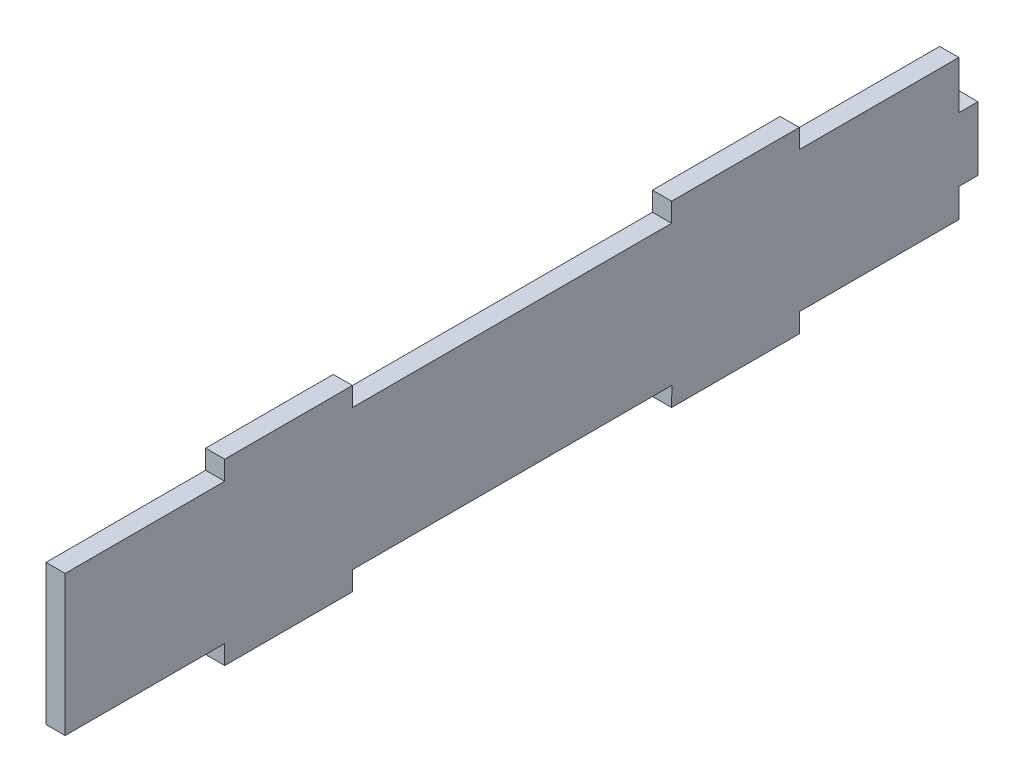
ISO-10303-21;
HEADER;
FILE_DESCRIPTION(('STEP AP214'),'2;1');
FILE_NAME('part.step','',(''),(''),'','','');
FILE_SCHEMA(('AUTOMOTIVE_DESIGN { 1 0 10303 214 1 1 1 1 }'));
ENDSEC;
DATA;
#1=APPLICATION_CONTEXT('core data for automotive mechanical design processes');
#2=APPLICATION_PROTOCOL_DEFINITION('international standard','automotive_design',2000,#1);
#3=PRODUCT_CONTEXT('',#1,'mechanical');
#4=PRODUCT('Part','Part','',(#3));
#5=PRODUCT_RELATED_PRODUCT_CATEGORY('part','',(#4));
#6=PRODUCT_DEFINITION_FORMATION('','',#4);
#7=PRODUCT_DEFINITION_CONTEXT('part definition',#1,'design');
#8=PRODUCT_DEFINITION('design','',#6,#7);
#9=PRODUCT_DEFINITION_SHAPE('','',#8);
#10=(LENGTH_UNIT() NAMED_UNIT(*) SI_UNIT(.MILLI.,.METRE.));
#11=(NAMED_UNIT(*) PLANE_ANGLE_UNIT() SI_UNIT($,.RADIAN.));
#12=(NAMED_UNIT(*) SI_UNIT($,.STERADIAN.) SOLID_ANGLE_UNIT());
#13=UNCERTAINTY_MEASURE_WITH_UNIT(LENGTH_MEASURE(1.E-05),#10,'distance_accuracy_value','');
#14=(GEOMETRIC_REPRESENTATION_CONTEXT(3) GLOBAL_UNCERTAINTY_ASSIGNED_CONTEXT((#13)) GLOBAL_UNIT_ASSIGNED_CONTEXT((#10,
#11,#12)) REPRESENTATION_CONTEXT('',''));
#15=CARTESIAN_POINT('',(0.,0.,0.));
#16=DIRECTION('',(0.,0.,1.));
#17=DIRECTION('',(1.,0.,0.));
#18=AXIS2_PLACEMENT_3D('',#15,#16,#17);
#19=CARTESIAN_POINT('',(-121.,7.50036982336795,-143.604067942456));
#20=DIRECTION('',(0.,1.,0.));
#21=DIRECTION('',(-1.,0.,0.));
#22=AXIS2_PLACEMENT_3D('',#19,#20,#21);
#23=PLANE('',#22);
#24=DIRECTION('',(0.,0.,1.));
#25=VECTOR('',#24,1.);
#26=CARTESIAN_POINT('',(-118.,7.50036982336795,-143.604067942456));
#27=LINE('',#26,#25);
#28=CARTESIAN_POINT('',(-118.,7.50036982336795,-143.604067942456));
#29=VERTEX_POINT('',#28);
#30=CARTESIAN_POINT('',(-118.,7.50036982336795,-140.604067942456));
#31=VERTEX_POINT('',#30);
#32=EDGE_CURVE('E224',#29,#31,#27,.T.);
#33=ORIENTED_EDGE('',*,*,#32,.T.);
#34=DIRECTION('',(1.,0.,0.));
#35=VECTOR('',#34,1.);
#36=CARTESIAN_POINT('',(-121.,7.50036982336795,-140.604067942456));
#37=LINE('',#36,#35);
#38=CARTESIAN_POINT('',(-121.,7.50036982336795,-140.604067942456));
#39=VERTEX_POINT('',#38);
#40=EDGE_CURVE('E11',#39,#31,#37,.T.);
#41=ORIENTED_EDGE('',*,*,#40,.F.);
#42=DIRECTION('',(0.,0.,1.));
#43=VECTOR('',#42,1.);
#44=CARTESIAN_POINT('',(-121.,7.50036982336795,-143.604067942456));
#45=LINE('',#44,#43);
#46=CARTESIAN_POINT('',(-121.,7.50036982336795,-143.604067942456));
#47=VERTEX_POINT('',#46);
#48=EDGE_CURVE('E270',#47,#39,#45,.T.);
#49=ORIENTED_EDGE('',*,*,#48,.F.);
#50=DIRECTION('',(1.,0.,0.));
#51=VECTOR('',#50,1.);
#52=CARTESIAN_POINT('',(-121.,7.50036982336795,-143.604067942456));
#53=LINE('',#52,#51);
#54=EDGE_CURVE('E220',#47,#29,#53,.T.);
#55=ORIENTED_EDGE('',*,*,#54,.T.);
#56=EDGE_LOOP('',(#33,#41,#49,#55));
#57=FACE_BOUND('',#56,.T.);
#58=ADVANCED_FACE('F32',(#57),#23,.F.);
#59=CARTESIAN_POINT('',(-121.,7.50036982336795,-140.604067942456));
#60=DIRECTION('',(0.,0.,1.));
#61=DIRECTION('',(1.,0.,0.));
#62=AXIS2_PLACEMENT_3D('',#59,#60,#61);
#63=PLANE('',#62);
#64=DIRECTION('',(0.,-1.,0.));
#65=VECTOR('',#64,1.);
#66=CARTESIAN_POINT('',(-118.,7.50036982336795,-140.604067942456));
#67=LINE('',#66,#65);
#68=CARTESIAN_POINT('',(-118.,3.00036982336795,-140.604067942456));
#69=VERTEX_POINT('',#68);
#70=EDGE_CURVE('E227',#31,#69,#67,.T.);
#71=ORIENTED_EDGE('',*,*,#70,.T.);
#72=DIRECTION('',(1.,0.,0.));
#73=VECTOR('',#72,1.);
#74=CARTESIAN_POINT('',(-121.,3.00036982336795,-140.604067942456));
#75=LINE('',#74,#73);
#76=CARTESIAN_POINT('',(-121.,3.00036982336795,-140.604067942456));
#77=VERTEX_POINT('',#76);
#78=EDGE_CURVE('E40',#77,#69,#75,.T.);
#79=ORIENTED_EDGE('',*,*,#78,.F.);
#80=DIRECTION('',(0.,-1.,0.));
#81=VECTOR('',#80,1.);
#82=CARTESIAN_POINT('',(-121.,7.50036982336795,-140.604067942456));
#83=LINE('',#82,#81);
#84=EDGE_CURVE('E139',#39,#77,#83,.T.);
#85=ORIENTED_EDGE('',*,*,#84,.F.);
#86=ORIENTED_EDGE('',*,*,#40,.T.);
#87=EDGE_LOOP('',(#71,#79,#85,#86));
#88=FACE_BOUND('',#87,.T.);
#89=ADVANCED_FACE('F408',(#88),#63,.F.);
#90=CARTESIAN_POINT('',(-121.,3.00036982336795,-115.604067942456));
#91=DIRECTION('',(0.,1.,0.));
#92=DIRECTION('',(-1.,0.,0.));
#93=AXIS2_PLACEMENT_3D('',#90,#91,#92);
#94=PLANE('',#93);
#95=DIRECTION('',(0.,0.,1.));
#96=VECTOR('',#95,1.);
#97=CARTESIAN_POINT('',(-118.,3.00036982336795,-115.604067942456));
#98=LINE('',#97,#96);
#99=CARTESIAN_POINT('',(-118.,3.00036982336795,-115.604067942456));
#100=VERTEX_POINT('',#99);
#101=EDGE_CURVE('E229',#69,#100,#98,.T.);
#102=ORIENTED_EDGE('',*,*,#101,.T.);
#103=DIRECTION('',(1.,0.,0.));
#104=VECTOR('',#103,1.);
#105=CARTESIAN_POINT('',(-121.,3.00036982336795,-115.604067942456));
#106=LINE('',#105,#104);
#107=CARTESIAN_POINT('',(-121.,3.00036982336795,-115.604067942456));
#108=VERTEX_POINT('',#107);
#109=EDGE_CURVE('E325',#108,#100,#106,.T.);
#110=ORIENTED_EDGE('',*,*,#109,.F.);
#111=DIRECTION('',(0.,0.,1.));
#112=VECTOR('',#111,1.);
#113=CARTESIAN_POINT('',(-121.,3.00036982336795,-115.604067942456));
#114=LINE('',#113,#112);
#115=EDGE_CURVE('E333',#77,#108,#114,.T.);
#116=ORIENTED_EDGE('',*,*,#115,.F.);
#117=ORIENTED_EDGE('',*,*,#78,.T.);
#118=EDGE_LOOP('',(#102,#110,#116,#117));
#119=FACE_BOUND('',#118,.T.);
#120=ADVANCED_FACE('F331',(#119),#94,.F.);
#121=CARTESIAN_POINT('',(-121.,0.00036982336792806,-115.604067942456));
#122=DIRECTION('',(0.,0.,1.));
#123=DIRECTION('',(1.,0.,0.));
#124=AXIS2_PLACEMENT_3D('',#121,#122,#123);
#125=PLANE('',#124);
#126=DIRECTION('',(0.,-1.,0.));
#127=VECTOR('',#126,1.);
#128=CARTESIAN_POINT('',(-118.,0.000369823367928476,-115.604067942456));
#129=LINE('',#128,#127);
#130=CARTESIAN_POINT('',(-118.,0.000369823367928476,-115.604067942456));
#131=VERTEX_POINT('',#130);
#132=EDGE_CURVE('E231',#100,#131,#129,.T.);
#133=ORIENTED_EDGE('',*,*,#132,.T.);
#134=DIRECTION('',(1.,0.,0.));
#135=VECTOR('',#134,1.);
#136=CARTESIAN_POINT('',(-121.,0.00036982336792806,-115.604067942456));
#137=LINE('',#136,#135);
#138=CARTESIAN_POINT('',(-121.,0.00036982336792806,-115.604067942456));
#139=VERTEX_POINT('',#138);
#140=EDGE_CURVE('E322',#139,#131,#137,.T.);
#141=ORIENTED_EDGE('',*,*,#140,.F.);
#142=DIRECTION('',(0.,-1.,0.));
#143=VECTOR('',#142,1.);
#144=CARTESIAN_POINT('',(-121.,0.00036982336792806,-115.604067942456));
#145=LINE('',#144,#143);
#146=EDGE_CURVE('E351',#108,#139,#145,.T.);
#147=ORIENTED_EDGE('',*,*,#146,.F.);
#148=ORIENTED_EDGE('',*,*,#109,.T.);
#149=EDGE_LOOP('',(#133,#141,#147,#148));
#150=FACE_BOUND('',#149,.T.);
#151=ADVANCED_FACE('F342',(#150),#125,.F.);
#152=CARTESIAN_POINT('',(-121.,0.00036982336792806,-95.6040679424561));
#153=DIRECTION('',(0.,1.,0.));
#154=DIRECTION('',(-1.,0.,0.));
#155=AXIS2_PLACEMENT_3D('',#152,#153,#154);
#156=PLANE('',#155);
#157=DIRECTION('',(0.,0.,1.));
#158=VECTOR('',#157,1.);
#159=CARTESIAN_POINT('',(-118.,0.000369823367928476,-95.6040679424561));
#160=LINE('',#159,#158);
#161=CARTESIAN_POINT('',(-118.,0.000369823367928476,-95.6040679424561));
#162=VERTEX_POINT('',#161);
#163=EDGE_CURVE('E233',#131,#162,#160,.T.);
#164=ORIENTED_EDGE('',*,*,#163,.T.);
#165=DIRECTION('',(1.,0.,0.));
#166=VECTOR('',#165,1.);
#167=CARTESIAN_POINT('',(-121.,0.00036982336792806,-95.6040679424561));
#168=LINE('',#167,#166);
#169=CARTESIAN_POINT('',(-121.,0.00036982336792806,-95.6040679424561));
#170=VERTEX_POINT('',#169);
#171=EDGE_CURVE('E319',#170,#162,#168,.T.);
#172=ORIENTED_EDGE('',*,*,#171,.F.);
#173=DIRECTION('',(0.,0.,1.));
#174=VECTOR('',#173,1.);
#175=CARTESIAN_POINT('',(-121.,0.00036982336792806,-95.6040679424561));
#176=LINE('',#175,#174);
#177=EDGE_CURVE('E348',#139,#170,#176,.T.);
#178=ORIENTED_EDGE('',*,*,#177,.F.);
#179=ORIENTED_EDGE('',*,*,#140,.T.);
#180=EDGE_LOOP('',(#164,#172,#178,#179));
#181=FACE_BOUND('',#180,.T.);
#182=ADVANCED_FACE('F346',(#181),#156,.F.);
#183=CARTESIAN_POINT('',(-121.,2.99999999999999,-95.6511721188984));
#184=DIRECTION('',(0.,-0.0157013921474556,-0.99987672554402));
#185=DIRECTION('',(0.,0.99987672554402,-0.0157013921474556));
#186=AXIS2_PLACEMENT_3D('',#183,#184,#185);
#187=PLANE('',#186);
#188=DIRECTION('',(0.,0.99987672554402,-0.0157013921474556));
#189=VECTOR('',#188,1.);
#190=CARTESIAN_POINT('',(-118.,2.99999999999999,-95.6511721188984));
#191=LINE('',#190,#189);
#192=CARTESIAN_POINT('',(-118.,2.99999999999999,-95.6511721188984));
#193=VERTEX_POINT('',#192);
#194=EDGE_CURVE('E235',#162,#193,#191,.T.);
#195=ORIENTED_EDGE('',*,*,#194,.T.);
#196=DIRECTION('',(1.,0.,0.));
#197=VECTOR('',#196,1.);
#198=CARTESIAN_POINT('',(-121.,2.99999999999999,-95.6511721188984));
#199=LINE('',#198,#197);
#200=CARTESIAN_POINT('',(-121.,2.99999999999999,-95.6511721188984));
#201=VERTEX_POINT('',#200);
#202=EDGE_CURVE('E316',#201,#193,#199,.T.);
#203=ORIENTED_EDGE('',*,*,#202,.F.);
#204=DIRECTION('',(0.,0.99987672554402,-0.0157013921474556));
#205=VECTOR('',#204,1.);
#206=CARTESIAN_POINT('',(-121.,2.99999999999999,-95.6511721188984));
#207=LINE('',#206,#205);
#208=EDGE_CURVE('E350',#170,#201,#207,.T.);
#209=ORIENTED_EDGE('',*,*,#208,.F.);
#210=ORIENTED_EDGE('',*,*,#171,.T.);
#211=EDGE_LOOP('',(#195,#203,#209,#210));
#212=FACE_BOUND('',#211,.T.);
#213=ADVANCED_FACE('F421',(#212),#187,.F.);
#214=CARTESIAN_POINT('',(-121.,3.00036982336794,-45.6040679424561));
#215=DIRECTION('',(0.,0.999999999972698,-7.38950582699085E-06));
#216=DIRECTION('',(0.,7.38950582699085E-06,0.999999999972698));
#217=AXIS2_PLACEMENT_3D('',#214,#215,#216);
#218=PLANE('',#217);
#219=DIRECTION('',(0.,7.38950582699085E-06,0.999999999972698));
#220=VECTOR('',#219,1.);
#221=CARTESIAN_POINT('',(-118.,3.00036982336794,-45.6040679424561));
#222=LINE('',#221,#220);
#223=CARTESIAN_POINT('',(-118.,3.00036982336794,-45.6040679424561));
#224=VERTEX_POINT('',#223);
#225=EDGE_CURVE('E237',#193,#224,#222,.T.);
#226=ORIENTED_EDGE('',*,*,#225,.T.);
#227=DIRECTION('',(1.,0.,0.));
#228=VECTOR('',#227,1.);
#229=CARTESIAN_POINT('',(-121.,3.00036982336794,-45.6040679424561));
#230=LINE('',#229,#228);
#231=CARTESIAN_POINT('',(-121.,3.00036982336794,-45.6040679424561));
#232=VERTEX_POINT('',#231);
#233=EDGE_CURVE('E313',#232,#224,#230,.T.);
#234=ORIENTED_EDGE('',*,*,#233,.F.);
#235=DIRECTION('',(0.,7.38950582699085E-06,0.999999999972698));
#236=VECTOR('',#235,1.);
#237=CARTESIAN_POINT('',(-121.,3.00036982336794,-45.6040679424561));
#238=LINE('',#237,#236);
#239=EDGE_CURVE('E353',#201,#232,#238,.T.);
#240=ORIENTED_EDGE('',*,*,#239,.F.);
#241=ORIENTED_EDGE('',*,*,#202,.T.);
#242=EDGE_LOOP('',(#226,#234,#240,#241));
#243=FACE_BOUND('',#242,.T.);
#244=ADVANCED_FACE('F424',(#243),#218,.F.);
#245=CARTESIAN_POINT('',(-121.,0.00036982336792806,-45.6040679424561));
#246=DIRECTION('',(0.,0.,1.));
#247=DIRECTION('',(0.,-1.,0.));
#248=AXIS2_PLACEMENT_3D('',#245,#246,#247);
#249=PLANE('',#248);
#250=DIRECTION('',(0.,-1.,0.));
#251=VECTOR('',#250,1.);
#252=CARTESIAN_POINT('',(-118.,0.000369823367928476,-45.6040679424561));
#253=LINE('',#252,#251);
#254=CARTESIAN_POINT('',(-118.,0.000369823367928476,-45.6040679424561));
#255=VERTEX_POINT('',#254);
#256=EDGE_CURVE('E239',#224,#255,#253,.T.);
#257=ORIENTED_EDGE('',*,*,#256,.T.);
#258=DIRECTION('',(1.,0.,0.));
#259=VECTOR('',#258,1.);
#260=CARTESIAN_POINT('',(-121.,0.00036982336792806,-45.6040679424561));
#261=LINE('',#260,#259);
#262=CARTESIAN_POINT('',(-121.,0.00036982336792806,-45.6040679424561));
#263=VERTEX_POINT('',#262);
#264=EDGE_CURVE('E310',#263,#255,#261,.T.);
#265=ORIENTED_EDGE('',*,*,#264,.F.);
#266=DIRECTION('',(0.,-1.,0.));
#267=VECTOR('',#266,1.);
#268=CARTESIAN_POINT('',(-121.,0.00036982336792806,-45.6040679424561));
#269=LINE('',#268,#267);
#270=EDGE_CURVE('E359',#232,#263,#269,.T.);
#271=ORIENTED_EDGE('',*,*,#270,.F.);
#272=ORIENTED_EDGE('',*,*,#233,.T.);
#273=EDGE_LOOP('',(#257,#265,#271,#272));
#274=FACE_BOUND('',#273,.T.);
#275=ADVANCED_FACE('F428',(#274),#249,.F.);
#276=CARTESIAN_POINT('',(-121.,0.000369823367939081,-25.6040679424561));
#277=DIRECTION('',(0.,1.,0.));
#278=DIRECTION('',(0.,0.,1.));
#279=AXIS2_PLACEMENT_3D('',#276,#277,#278);
#280=PLANE('',#279);
#281=DIRECTION('',(0.,0.,1.));
#282=VECTOR('',#281,1.);
#283=CARTESIAN_POINT('',(-118.,0.000369823367939498,-25.6040679424561));
#284=LINE('',#283,#282);
#285=CARTESIAN_POINT('',(-118.,0.000369823367939498,-25.6040679424561));
#286=VERTEX_POINT('',#285);
#287=EDGE_CURVE('E241',#255,#286,#284,.T.);
#288=ORIENTED_EDGE('',*,*,#287,.T.);
#289=DIRECTION('',(1.,0.,0.));
#290=VECTOR('',#289,1.);
#291=CARTESIAN_POINT('',(-121.,0.000369823367939081,-25.6040679424561));
#292=LINE('',#291,#290);
#293=CARTESIAN_POINT('',(-121.,0.000369823367939081,-25.6040679424561));
#294=VERTEX_POINT('',#293);
#295=EDGE_CURVE('E307',#294,#286,#292,.T.);
#296=ORIENTED_EDGE('',*,*,#295,.F.);
#297=DIRECTION('',(0.,0.,1.));
#298=VECTOR('',#297,1.);
#299=CARTESIAN_POINT('',(-121.,0.000369823367939081,-25.6040679424561));
#300=LINE('',#299,#298);
#301=EDGE_CURVE('E361',#263,#294,#300,.T.);
#302=ORIENTED_EDGE('',*,*,#301,.F.);
#303=ORIENTED_EDGE('',*,*,#264,.T.);
#304=EDGE_LOOP('',(#288,#296,#302,#303));
#305=FACE_BOUND('',#304,.T.);
#306=ADVANCED_FACE('F432',(#305),#280,.F.);
#307=CARTESIAN_POINT('',(-121.,3.00036982336794,-25.6040679424561));
#308=DIRECTION('',(0.,0.,-1.));
#309=DIRECTION('',(-1.,0.,0.));
#310=AXIS2_PLACEMENT_3D('',#307,#308,#309);
#311=PLANE('',#310);
#312=DIRECTION('',(0.,1.,0.));
#313=VECTOR('',#312,1.);
#314=CARTESIAN_POINT('',(-118.,3.00036982336794,-25.6040679424561));
#315=LINE('',#314,#313);
#316=CARTESIAN_POINT('',(-118.,3.00036982336794,-25.6040679424561));
#317=VERTEX_POINT('',#316);
#318=EDGE_CURVE('E243',#286,#317,#315,.T.);
#319=ORIENTED_EDGE('',*,*,#318,.T.);
#320=DIRECTION('',(1.,0.,0.));
#321=VECTOR('',#320,1.);
#322=CARTESIAN_POINT('',(-121.,3.00036982336794,-25.6040679424561));
#323=LINE('',#322,#321);
#324=CARTESIAN_POINT('',(-121.,3.00036982336794,-25.6040679424561));
#325=VERTEX_POINT('',#324);
#326=EDGE_CURVE('E304',#325,#317,#323,.T.);
#327=ORIENTED_EDGE('',*,*,#326,.F.);
#328=DIRECTION('',(0.,1.,0.));
#329=VECTOR('',#328,1.);
#330=CARTESIAN_POINT('',(-121.,3.00036982336794,-25.6040679424561));
#331=LINE('',#330,#329);
#332=EDGE_CURVE('E363',#294,#325,#331,.T.);
#333=ORIENTED_EDGE('',*,*,#332,.F.);
#334=ORIENTED_EDGE('',*,*,#295,.T.);
#335=EDGE_LOOP('',(#319,#327,#333,#334));
#336=FACE_BOUND('',#335,.T.);
#337=ADVANCED_FACE('F436',(#336),#311,.F.);
#338=CARTESIAN_POINT('',(-121.,3.00036982336794,-0.604067942456082));
#339=DIRECTION('',(0.,1.,0.));
#340=DIRECTION('',(-1.,0.,0.));
#341=AXIS2_PLACEMENT_3D('',#338,#339,#340);
#342=PLANE('',#341);
#343=DIRECTION('',(0.,0.,1.));
#344=VECTOR('',#343,1.);
#345=CARTESIAN_POINT('',(-118.,3.00036982336794,-0.604067942456082));
#346=LINE('',#345,#344);
#347=CARTESIAN_POINT('',(-118.,3.00036982336794,-0.604067942456082));
#348=VERTEX_POINT('',#347);
#349=EDGE_CURVE('E245',#317,#348,#346,.T.);
#350=ORIENTED_EDGE('',*,*,#349,.T.);
#351=DIRECTION('',(1.,0.,0.));
#352=VECTOR('',#351,1.);
#353=CARTESIAN_POINT('',(-121.,3.00036982336794,-0.604067942456082));
#354=LINE('',#353,#352);
#355=CARTESIAN_POINT('',(-121.,3.00036982336794,-0.604067942456082));
#356=VERTEX_POINT('',#355);
#357=EDGE_CURVE('E301',#356,#348,#354,.T.);
#358=ORIENTED_EDGE('',*,*,#357,.F.);
#359=DIRECTION('',(0.,0.,1.));
#360=VECTOR('',#359,1.);
#361=CARTESIAN_POINT('',(-121.,3.00036982336794,-0.604067942456082));
#362=LINE('',#361,#360);
#363=EDGE_CURVE('E365',#325,#356,#362,.T.);
#364=ORIENTED_EDGE('',*,*,#363,.F.);
#365=ORIENTED_EDGE('',*,*,#326,.T.);
#366=EDGE_LOOP('',(#350,#358,#364,#365));
#367=FACE_BOUND('',#366,.T.);
#368=ADVANCED_FACE('F440',(#367),#342,.F.);
#369=CARTESIAN_POINT('',(-121.,3.00036982336794,-0.604067942456082));
#370=DIRECTION('',(0.,0.,-1.));
#371=DIRECTION('',(-1.,0.,0.));
#372=AXIS2_PLACEMENT_3D('',#369,#370,#371);
#373=PLANE('',#372);
#374=DIRECTION('',(0.,1.,0.));
#375=VECTOR('',#374,1.);
#376=CARTESIAN_POINT('',(-118.,3.00036982336794,-0.604067942456082));
#377=LINE('',#376,#375);
#378=CARTESIAN_POINT('',(-118.,25.0003698233679,-0.604067942456082));
#379=VERTEX_POINT('',#378);
#380=EDGE_CURVE('E247',#348,#379,#377,.T.);
#381=ORIENTED_EDGE('',*,*,#380,.T.);
#382=DIRECTION('',(1.,0.,0.));
#383=VECTOR('',#382,1.);
#384=CARTESIAN_POINT('',(-121.,25.0003698233679,-0.604067942456082));
#385=LINE('',#384,#383);
#386=CARTESIAN_POINT('',(-121.,25.0003698233679,-0.604067942456082));
#387=VERTEX_POINT('',#386);
#388=EDGE_CURVE('E298',#387,#379,#385,.T.);
#389=ORIENTED_EDGE('',*,*,#388,.F.);
#390=DIRECTION('',(0.,1.,0.));
#391=VECTOR('',#390,1.);
#392=CARTESIAN_POINT('',(-121.,3.00036982336794,-0.604067942456082));
#393=LINE('',#392,#391);
#394=EDGE_CURVE('E367',#356,#387,#393,.T.);
#395=ORIENTED_EDGE('',*,*,#394,.F.);
#396=ORIENTED_EDGE('',*,*,#357,.T.);
#397=EDGE_LOOP('',(#381,#389,#395,#396));
#398=FACE_BOUND('',#397,.T.);
#399=ADVANCED_FACE('F444',(#398),#373,.F.);
#400=CARTESIAN_POINT('',(-121.,25.0003698233679,-25.6040679424561));
#401=DIRECTION('',(0.,-1.,0.));
#402=DIRECTION('',(1.,0.,0.));
#403=AXIS2_PLACEMENT_3D('',#400,#401,#402);
#404=PLANE('',#403);
#405=DIRECTION('',(0.,0.,-1.));
#406=VECTOR('',#405,1.);
#407=CARTESIAN_POINT('',(-118.,25.0003698233679,-25.6040679424561));
#408=LINE('',#407,#406);
#409=CARTESIAN_POINT('',(-118.,25.0003698233679,-25.6040679424561));
#410=VERTEX_POINT('',#409);
#411=EDGE_CURVE('E249',#379,#410,#408,.T.);
#412=ORIENTED_EDGE('',*,*,#411,.T.);
#413=DIRECTION('',(1.,0.,0.));
#414=VECTOR('',#413,1.);
#415=CARTESIAN_POINT('',(-121.,25.0003698233679,-25.6040679424561));
#416=LINE('',#415,#414);
#417=CARTESIAN_POINT('',(-121.,25.0003698233679,-25.6040679424561));
#418=VERTEX_POINT('',#417);
#419=EDGE_CURVE('E295',#418,#410,#416,.T.);
#420=ORIENTED_EDGE('',*,*,#419,.F.);
#421=DIRECTION('',(0.,0.,-1.));
#422=VECTOR('',#421,1.);
#423=CARTESIAN_POINT('',(-121.,25.0003698233679,-25.6040679424561));
#424=LINE('',#423,#422);
#425=EDGE_CURVE('E369',#387,#418,#424,.T.);
#426=ORIENTED_EDGE('',*,*,#425,.F.);
#427=ORIENTED_EDGE('',*,*,#388,.T.);
#428=EDGE_LOOP('',(#412,#420,#426,#427));
#429=FACE_BOUND('',#428,.T.);
#430=ADVANCED_FACE('F448',(#429),#404,.F.);
#431=CARTESIAN_POINT('',(-121.,28.0003698233679,-25.6040679424561));
#432=DIRECTION('',(0.,0.,-1.));
#433=DIRECTION('',(0.,1.,0.));
#434=AXIS2_PLACEMENT_3D('',#431,#432,#433);
#435=PLANE('',#434);
#436=DIRECTION('',(0.,1.,0.));
#437=VECTOR('',#436,1.);
#438=CARTESIAN_POINT('',(-118.,28.0003698233679,-25.6040679424561));
#439=LINE('',#438,#437);
#440=CARTESIAN_POINT('',(-118.,28.0003698233679,-25.6040679424561));
#441=VERTEX_POINT('',#440);
#442=EDGE_CURVE('E251',#410,#441,#439,.T.);
#443=ORIENTED_EDGE('',*,*,#442,.T.);
#444=DIRECTION('',(1.,0.,0.));
#445=VECTOR('',#444,1.);
#446=CARTESIAN_POINT('',(-121.,28.0003698233679,-25.6040679424561));
#447=LINE('',#446,#445);
#448=CARTESIAN_POINT('',(-121.,28.0003698233679,-25.6040679424561));
#449=VERTEX_POINT('',#448);
#450=EDGE_CURVE('E292',#449,#441,#447,.T.);
#451=ORIENTED_EDGE('',*,*,#450,.F.);
#452=DIRECTION('',(0.,1.,0.));
#453=VECTOR('',#452,1.);
#454=CARTESIAN_POINT('',(-121.,28.0003698233679,-25.6040679424561));
#455=LINE('',#454,#453);
#456=EDGE_CURVE('E371',#418,#449,#455,.T.);
#457=ORIENTED_EDGE('',*,*,#456,.F.);
#458=ORIENTED_EDGE('',*,*,#419,.T.);
#459=EDGE_LOOP('',(#443,#451,#457,#458));
#460=FACE_BOUND('',#459,.T.);
#461=ADVANCED_FACE('F452',(#460),#435,.F.);
#462=CARTESIAN_POINT('',(-121.,28.0003698233679,-25.6040679424561));
#463=DIRECTION('',(0.,-1.,0.));
#464=DIRECTION('',(0.,0.,-1.));
#465=AXIS2_PLACEMENT_3D('',#462,#463,#464);
#466=PLANE('',#465);
#467=DIRECTION('',(0.,0.,-1.));
#468=VECTOR('',#467,1.);
#469=CARTESIAN_POINT('',(-118.,28.0003698233679,-25.6040679424561));
#470=LINE('',#469,#468);
#471=CARTESIAN_POINT('',(-118.,28.0003698233679,-45.6040679424561));
#472=VERTEX_POINT('',#471);
#473=EDGE_CURVE('E253',#441,#472,#470,.T.);
#474=ORIENTED_EDGE('',*,*,#473,.T.);
#475=DIRECTION('',(1.,0.,0.));
#476=VECTOR('',#475,1.);
#477=CARTESIAN_POINT('',(-121.,28.0003698233679,-45.6040679424561));
#478=LINE('',#477,#476);
#479=CARTESIAN_POINT('',(-121.,28.0003698233679,-45.6040679424561));
#480=VERTEX_POINT('',#479);
#481=EDGE_CURVE('E289',#480,#472,#478,.T.);
#482=ORIENTED_EDGE('',*,*,#481,.F.);
#483=DIRECTION('',(0.,0.,-1.));
#484=VECTOR('',#483,1.);
#485=CARTESIAN_POINT('',(-121.,28.0003698233679,-25.6040679424561));
#486=LINE('',#485,#484);
#487=EDGE_CURVE('E373',#449,#480,#486,.T.);
#488=ORIENTED_EDGE('',*,*,#487,.F.);
#489=ORIENTED_EDGE('',*,*,#450,.T.);
#490=EDGE_LOOP('',(#474,#482,#488,#489));
#491=FACE_BOUND('',#490,.T.);
#492=ADVANCED_FACE('F456',(#491),#466,.F.);
#493=CARTESIAN_POINT('',(-121.,25.0003698233679,-45.6040679424561));
#494=DIRECTION('',(0.,0.,1.));
#495=DIRECTION('',(1.,0.,0.));
#496=AXIS2_PLACEMENT_3D('',#493,#494,#495);
#497=PLANE('',#496);
#498=DIRECTION('',(0.,-1.,0.));
#499=VECTOR('',#498,1.);
#500=CARTESIAN_POINT('',(-118.,25.0003698233679,-45.6040679424561));
#501=LINE('',#500,#499);
#502=CARTESIAN_POINT('',(-118.,25.0003698233679,-45.6040679424561));
#503=VERTEX_POINT('',#502);
#504=EDGE_CURVE('E255',#472,#503,#501,.T.);
#505=ORIENTED_EDGE('',*,*,#504,.T.);
#506=DIRECTION('',(1.,0.,0.));
#507=VECTOR('',#506,1.);
#508=CARTESIAN_POINT('',(-121.,25.0003698233679,-45.6040679424561));
#509=LINE('',#508,#507);
#510=CARTESIAN_POINT('',(-121.,25.0003698233679,-45.6040679424561));
#511=VERTEX_POINT('',#510);
#512=EDGE_CURVE('E286',#511,#503,#509,.T.);
#513=ORIENTED_EDGE('',*,*,#512,.F.);
#514=DIRECTION('',(0.,-1.,0.));
#515=VECTOR('',#514,1.);
#516=CARTESIAN_POINT('',(-121.,25.0003698233679,-45.6040679424561));
#517=LINE('',#516,#515);
#518=EDGE_CURVE('E375',#480,#511,#517,.T.);
#519=ORIENTED_EDGE('',*,*,#518,.F.);
#520=ORIENTED_EDGE('',*,*,#481,.T.);
#521=EDGE_LOOP('',(#505,#513,#519,#520));
#522=FACE_BOUND('',#521,.T.);
#523=ADVANCED_FACE('F460',(#522),#497,.F.);
#524=CARTESIAN_POINT('',(-121.,25.0003698233679,-95.604067942456));
#525=DIRECTION('',(0.,-1.,0.));
#526=DIRECTION('',(1.,0.,0.));
#527=AXIS2_PLACEMENT_3D('',#524,#525,#526);
#528=PLANE('',#527);
#529=DIRECTION('',(0.,0.,-1.));
#530=VECTOR('',#529,1.);
#531=CARTESIAN_POINT('',(-118.,25.0003698233679,-95.604067942456));
#532=LINE('',#531,#530);
#533=CARTESIAN_POINT('',(-118.,25.0003698233679,-95.604067942456));
#534=VERTEX_POINT('',#533);
#535=EDGE_CURVE('E257',#503,#534,#532,.T.);
#536=ORIENTED_EDGE('',*,*,#535,.T.);
#537=DIRECTION('',(1.,0.,0.));
#538=VECTOR('',#537,1.);
#539=CARTESIAN_POINT('',(-121.,25.0003698233679,-95.604067942456));
#540=LINE('',#539,#538);
#541=CARTESIAN_POINT('',(-121.,25.0003698233679,-95.604067942456));
#542=VERTEX_POINT('',#541);
#543=EDGE_CURVE('E283',#542,#534,#540,.T.);
#544=ORIENTED_EDGE('',*,*,#543,.F.);
#545=DIRECTION('',(0.,0.,-1.));
#546=VECTOR('',#545,1.);
#547=CARTESIAN_POINT('',(-121.,25.0003698233679,-95.604067942456));
#548=LINE('',#547,#546);
#549=EDGE_CURVE('E377',#511,#542,#548,.T.);
#550=ORIENTED_EDGE('',*,*,#549,.F.);
#551=ORIENTED_EDGE('',*,*,#512,.T.);
#552=EDGE_LOOP('',(#536,#544,#550,#551));
#553=FACE_BOUND('',#552,.T.);
#554=ADVANCED_FACE('F464',(#553),#528,.F.);
#555=CARTESIAN_POINT('',(-121.,28.0003698233679,-95.6040679424561));
#556=DIRECTION('',(0.,0.,-1.));
#557=DIRECTION('',(0.,1.,0.));
#558=AXIS2_PLACEMENT_3D('',#555,#556,#557);
#559=PLANE('',#558);
#560=DIRECTION('',(0.,1.,0.));
#561=VECTOR('',#560,1.);
#562=CARTESIAN_POINT('',(-118.,28.0003698233679,-95.6040679424561));
#563=LINE('',#562,#561);
#564=CARTESIAN_POINT('',(-118.,28.0003698233679,-95.6040679424561));
#565=VERTEX_POINT('',#564);
#566=EDGE_CURVE('E259',#534,#565,#563,.T.);
#567=ORIENTED_EDGE('',*,*,#566,.T.);
#568=DIRECTION('',(1.,0.,0.));
#569=VECTOR('',#568,1.);
#570=CARTESIAN_POINT('',(-121.,28.0003698233679,-95.6040679424561));
#571=LINE('',#570,#569);
#572=CARTESIAN_POINT('',(-121.,28.0003698233679,-95.6040679424561));
#573=VERTEX_POINT('',#572);
#574=EDGE_CURVE('E280',#573,#565,#571,.T.);
#575=ORIENTED_EDGE('',*,*,#574,.F.);
#576=DIRECTION('',(0.,1.,0.));
#577=VECTOR('',#576,1.);
#578=CARTESIAN_POINT('',(-121.,28.0003698233679,-95.6040679424561));
#579=LINE('',#578,#577);
#580=EDGE_CURVE('E379',#542,#573,#579,.T.);
#581=ORIENTED_EDGE('',*,*,#580,.F.);
#582=ORIENTED_EDGE('',*,*,#543,.T.);
#583=EDGE_LOOP('',(#567,#575,#581,#582));
#584=FACE_BOUND('',#583,.T.);
#585=ADVANCED_FACE('F468',(#584),#559,.F.);
#586=CARTESIAN_POINT('',(-121.,28.0003698233679,-95.6040679424561));
#587=DIRECTION('',(0.,-1.,0.));
#588=DIRECTION('',(0.,0.,-1.));
#589=AXIS2_PLACEMENT_3D('',#586,#587,#588);
#590=PLANE('',#589);
#591=DIRECTION('',(0.,0.,-1.));
#592=VECTOR('',#591,1.);
#593=CARTESIAN_POINT('',(-118.,28.0003698233679,-95.6040679424561));
#594=LINE('',#593,#592);
#595=CARTESIAN_POINT('',(-118.,28.0003698233679,-115.604067942456));
#596=VERTEX_POINT('',#595);
#597=EDGE_CURVE('E261',#565,#596,#594,.T.);
#598=ORIENTED_EDGE('',*,*,#597,.T.);
#599=DIRECTION('',(1.,0.,0.));
#600=VECTOR('',#599,1.);
#601=CARTESIAN_POINT('',(-121.,28.0003698233679,-115.604067942456));
#602=LINE('',#601,#600);
#603=CARTESIAN_POINT('',(-121.,28.0003698233679,-115.604067942456));
#604=VERTEX_POINT('',#603);
#605=EDGE_CURVE('E277',#604,#596,#602,.T.);
#606=ORIENTED_EDGE('',*,*,#605,.F.);
#607=DIRECTION('',(0.,0.,-1.));
#608=VECTOR('',#607,1.);
#609=CARTESIAN_POINT('',(-121.,28.0003698233679,-95.6040679424561));
#610=LINE('',#609,#608);
#611=EDGE_CURVE('E381',#573,#604,#610,.T.);
#612=ORIENTED_EDGE('',*,*,#611,.F.);
#613=ORIENTED_EDGE('',*,*,#574,.T.);
#614=EDGE_LOOP('',(#598,#606,#612,#613));
#615=FACE_BOUND('',#614,.T.);
#616=ADVANCED_FACE('F472',(#615),#590,.F.);
#617=CARTESIAN_POINT('',(-121.,25.0003698233679,-115.604067942456));
#618=DIRECTION('',(0.,0.,1.));
#619=DIRECTION('',(1.,0.,0.));
#620=AXIS2_PLACEMENT_3D('',#617,#618,#619);
#621=PLANE('',#620);
#622=DIRECTION('',(0.,-1.,0.));
#623=VECTOR('',#622,1.);
#624=CARTESIAN_POINT('',(-118.,25.0003698233679,-115.604067942456));
#625=LINE('',#624,#623);
#626=CARTESIAN_POINT('',(-118.,25.0003698233679,-115.604067942456));
#627=VERTEX_POINT('',#626);
#628=EDGE_CURVE('E263',#596,#627,#625,.T.);
#629=ORIENTED_EDGE('',*,*,#628,.T.);
#630=DIRECTION('',(1.,0.,0.));
#631=VECTOR('',#630,1.);
#632=CARTESIAN_POINT('',(-121.,25.0003698233679,-115.604067942456));
#633=LINE('',#632,#631);
#634=CARTESIAN_POINT('',(-121.,25.0003698233679,-115.604067942456));
#635=VERTEX_POINT('',#634);
#636=EDGE_CURVE('E274',#635,#627,#633,.T.);
#637=ORIENTED_EDGE('',*,*,#636,.F.);
#638=DIRECTION('',(0.,-1.,0.));
#639=VECTOR('',#638,1.);
#640=CARTESIAN_POINT('',(-121.,25.0003698233679,-115.604067942456));
#641=LINE('',#640,#639);
#642=EDGE_CURVE('E383',#604,#635,#641,.T.);
#643=ORIENTED_EDGE('',*,*,#642,.F.);
#644=ORIENTED_EDGE('',*,*,#605,.T.);
#645=EDGE_LOOP('',(#629,#637,#643,#644));
#646=FACE_BOUND('',#645,.T.);
#647=ADVANCED_FACE('F389',(#646),#621,.F.);
#648=CARTESIAN_POINT('',(-121.,25.0003698233679,-140.604067942456));
#649=DIRECTION('',(0.,-1.,0.));
#650=DIRECTION('',(1.,0.,0.));
#651=AXIS2_PLACEMENT_3D('',#648,#649,#650);
#652=PLANE('',#651);
#653=DIRECTION('',(0.,0.,-1.));
#654=VECTOR('',#653,1.);
#655=CARTESIAN_POINT('',(-118.,25.0003698233679,-140.604067942456));
#656=LINE('',#655,#654);
#657=CARTESIAN_POINT('',(-118.,25.0003698233679,-140.604067942456));
#658=VERTEX_POINT('',#657);
#659=EDGE_CURVE('E265',#627,#658,#656,.T.);
#660=ORIENTED_EDGE('',*,*,#659,.T.);
#661=DIRECTION('',(1.,0.,0.));
#662=VECTOR('',#661,1.);
#663=CARTESIAN_POINT('',(-121.,25.0003698233679,-140.604067942456));
#664=LINE('',#663,#662);
#665=CARTESIAN_POINT('',(-121.,25.0003698233679,-140.604067942456));
#666=VERTEX_POINT('',#665);
#667=EDGE_CURVE('E215',#666,#658,#664,.T.);
#668=ORIENTED_EDGE('',*,*,#667,.F.);
#669=DIRECTION('',(0.,0.,-1.));
#670=VECTOR('',#669,1.);
#671=CARTESIAN_POINT('',(-121.,25.0003698233679,-140.604067942456));
#672=LINE('',#671,#670);
#673=EDGE_CURVE('E206',#635,#666,#672,.T.);
#674=ORIENTED_EDGE('',*,*,#673,.F.);
#675=ORIENTED_EDGE('',*,*,#636,.T.);
#676=EDGE_LOOP('',(#660,#668,#674,#675));
#677=FACE_BOUND('',#676,.T.);
#678=ADVANCED_FACE('F393',(#677),#652,.F.);
#679=CARTESIAN_POINT('',(-121.,25.0003698233679,-140.604067942456));
#680=DIRECTION('',(0.,0.,1.));
#681=DIRECTION('',(1.,0.,0.));
#682=AXIS2_PLACEMENT_3D('',#679,#680,#681);
#683=PLANE('',#682);
#684=DIRECTION('',(0.,-1.,0.));
#685=VECTOR('',#684,1.);
#686=CARTESIAN_POINT('',(-118.,25.0003698233679,-140.604067942456));
#687=LINE('',#686,#685);
#688=CARTESIAN_POINT('',(-118.,17.5003698233679,-140.604067942456));
#689=VERTEX_POINT('',#688);
#690=EDGE_CURVE('E214',#658,#689,#687,.T.);
#691=ORIENTED_EDGE('',*,*,#690,.T.);
#692=DIRECTION('',(1.,0.,0.));
#693=VECTOR('',#692,1.);
#694=CARTESIAN_POINT('',(-121.,17.5003698233679,-140.604067942456));
#695=LINE('',#694,#693);
#696=CARTESIAN_POINT('',(-121.,17.5003698233679,-140.604067942456));
#697=VERTEX_POINT('',#696);
#698=EDGE_CURVE('E211',#697,#689,#695,.T.);
#699=ORIENTED_EDGE('',*,*,#698,.F.);
#700=DIRECTION('',(0.,-1.,0.));
#701=VECTOR('',#700,1.);
#702=CARTESIAN_POINT('',(-121.,25.0003698233679,-140.604067942456));
#703=LINE('',#702,#701);
#704=EDGE_CURVE('E200',#666,#697,#703,.T.);
#705=ORIENTED_EDGE('',*,*,#704,.F.);
#706=ORIENTED_EDGE('',*,*,#667,.T.);
#707=EDGE_LOOP('',(#691,#699,#705,#706));
#708=FACE_BOUND('',#707,.T.);
#709=ADVANCED_FACE('F212',(#708),#683,.F.);
#710=CARTESIAN_POINT('',(-121.,17.5003698233679,-140.604067942456));
#711=DIRECTION('',(0.,-1.,0.));
#712=DIRECTION('',(1.,0.,0.));
#713=AXIS2_PLACEMENT_3D('',#710,#711,#712);
#714=PLANE('',#713);
#715=DIRECTION('',(0.,0.,-1.));
#716=VECTOR('',#715,1.);
#717=CARTESIAN_POINT('',(-118.,17.5003698233679,-140.604067942456));
#718=LINE('',#717,#716);
#719=CARTESIAN_POINT('',(-118.,17.5003698233679,-143.604067942456));
#720=VERTEX_POINT('',#719);
#721=EDGE_CURVE('E125',#689,#720,#718,.T.);
#722=ORIENTED_EDGE('',*,*,#721,.T.);
#723=DIRECTION('',(1.,0.,0.));
#724=VECTOR('',#723,1.);
#725=CARTESIAN_POINT('',(-121.,17.5003698233679,-143.604067942456));
#726=LINE('',#725,#724);
#727=CARTESIAN_POINT('',(-121.,17.5003698233679,-143.604067942456));
#728=VERTEX_POINT('',#727);
#729=EDGE_CURVE('E216',#728,#720,#726,.T.);
#730=ORIENTED_EDGE('',*,*,#729,.F.);
#731=DIRECTION('',(0.,0.,-1.));
#732=VECTOR('',#731,1.);
#733=CARTESIAN_POINT('',(-121.,17.5003698233679,-140.604067942456));
#734=LINE('',#733,#732);
#735=EDGE_CURVE('E204',#697,#728,#734,.T.);
#736=ORIENTED_EDGE('',*,*,#735,.F.);
#737=ORIENTED_EDGE('',*,*,#698,.T.);
#738=EDGE_LOOP('',(#722,#730,#736,#737));
#739=FACE_BOUND('',#738,.T.);
#740=ADVANCED_FACE('F218',(#739),#714,.F.);
#741=CARTESIAN_POINT('',(-121.,7.50036982336795,-143.604067942456));
#742=DIRECTION('',(0.,0.,1.));
#743=DIRECTION('',(1.,0.,0.));
#744=AXIS2_PLACEMENT_3D('',#741,#742,#743);
#745=PLANE('',#744);
#746=DIRECTION('',(0.,-1.,0.));
#747=VECTOR('',#746,1.);
#748=CARTESIAN_POINT('',(-118.,7.50036982336795,-143.604067942456));
#749=LINE('',#748,#747);
#750=EDGE_CURVE('E131',#720,#29,#749,.T.);
#751=ORIENTED_EDGE('',*,*,#750,.T.);
#752=ORIENTED_EDGE('',*,*,#54,.F.);
#753=DIRECTION('',(0.,-1.,0.));
#754=VECTOR('',#753,1.);
#755=CARTESIAN_POINT('',(-121.,7.50036982336795,-143.604067942456));
#756=LINE('',#755,#754);
#757=EDGE_CURVE('E48',#728,#47,#756,.T.);
#758=ORIENTED_EDGE('',*,*,#757,.F.);
#759=ORIENTED_EDGE('',*,*,#729,.T.);
#760=EDGE_LOOP('',(#751,#752,#758,#759));
#761=FACE_BOUND('',#760,.T.);
#762=ADVANCED_FACE('F397',(#761),#745,.F.);
#763=CARTESIAN_POINT('',(-121.,0.,0.));
#764=DIRECTION('',(1.,0.,0.));
#765=DIRECTION('',(0.,0.,-1.));
#766=AXIS2_PLACEMENT_3D('',#763,#764,#765);
#767=PLANE('',#766);
#768=ORIENTED_EDGE('',*,*,#48,.T.);
#769=ORIENTED_EDGE('',*,*,#84,.T.);
#770=ORIENTED_EDGE('',*,*,#115,.T.);
#771=ORIENTED_EDGE('',*,*,#146,.T.);
#772=ORIENTED_EDGE('',*,*,#177,.T.);
#773=ORIENTED_EDGE('',*,*,#208,.T.);
#774=ORIENTED_EDGE('',*,*,#239,.T.);
#775=ORIENTED_EDGE('',*,*,#270,.T.);
#776=ORIENTED_EDGE('',*,*,#301,.T.);
#777=ORIENTED_EDGE('',*,*,#332,.T.);
#778=ORIENTED_EDGE('',*,*,#363,.T.);
#779=ORIENTED_EDGE('',*,*,#394,.T.);
#780=ORIENTED_EDGE('',*,*,#425,.T.);
#781=ORIENTED_EDGE('',*,*,#456,.T.);
#782=ORIENTED_EDGE('',*,*,#487,.T.);
#783=ORIENTED_EDGE('',*,*,#518,.T.);
#784=ORIENTED_EDGE('',*,*,#549,.T.);
#785=ORIENTED_EDGE('',*,*,#580,.T.);
#786=ORIENTED_EDGE('',*,*,#611,.T.);
#787=ORIENTED_EDGE('',*,*,#642,.T.);
#788=ORIENTED_EDGE('',*,*,#673,.T.);
#789=ORIENTED_EDGE('',*,*,#704,.T.);
#790=ORIENTED_EDGE('',*,*,#735,.T.);
#791=ORIENTED_EDGE('',*,*,#757,.T.);
#792=EDGE_LOOP('',(#768,#769,#770,#771,#772,#773,#774,#775,#776,#777,#778,#779,#780,#781,#782,
#783,#784,#785,#786,#787,#788,#789,#790,#791));
#793=FACE_BOUND('',#792,.T.);
#794=ADVANCED_FACE('F202',(#793),#767,.F.);
#795=CARTESIAN_POINT('',(-118.,0.,0.));
#796=DIRECTION('',(1.,0.,0.));
#797=DIRECTION('',(0.,0.,-1.));
#798=AXIS2_PLACEMENT_3D('',#795,#796,#797);
#799=PLANE('',#798);
#800=ORIENTED_EDGE('',*,*,#32,.F.);
#801=ORIENTED_EDGE('',*,*,#750,.F.);
#802=ORIENTED_EDGE('',*,*,#721,.F.);
#803=ORIENTED_EDGE('',*,*,#690,.F.);
#804=ORIENTED_EDGE('',*,*,#659,.F.);
#805=ORIENTED_EDGE('',*,*,#628,.F.);
#806=ORIENTED_EDGE('',*,*,#597,.F.);
#807=ORIENTED_EDGE('',*,*,#566,.F.);
#808=ORIENTED_EDGE('',*,*,#535,.F.);
#809=ORIENTED_EDGE('',*,*,#504,.F.);
#810=ORIENTED_EDGE('',*,*,#473,.F.);
#811=ORIENTED_EDGE('',*,*,#442,.F.);
#812=ORIENTED_EDGE('',*,*,#411,.F.);
#813=ORIENTED_EDGE('',*,*,#380,.F.);
#814=ORIENTED_EDGE('',*,*,#349,.F.);
#815=ORIENTED_EDGE('',*,*,#318,.F.);
#816=ORIENTED_EDGE('',*,*,#287,.F.);
#817=ORIENTED_EDGE('',*,*,#256,.F.);
#818=ORIENTED_EDGE('',*,*,#225,.F.);
#819=ORIENTED_EDGE('',*,*,#194,.F.);
#820=ORIENTED_EDGE('',*,*,#163,.F.);
#821=ORIENTED_EDGE('',*,*,#132,.F.);
#822=ORIENTED_EDGE('',*,*,#101,.F.);
#823=ORIENTED_EDGE('',*,*,#70,.F.);
#824=EDGE_LOOP('',(#800,#801,#802,#803,#804,#805,#806,#807,#808,#809,#810,#811,#812,#813,#814,
#815,#816,#817,#818,#819,#820,#821,#822,#823));
#825=FACE_BOUND('',#824,.T.);
#826=ADVANCED_FACE('F337',(#825),#799,.T.);
#827=CLOSED_SHELL('',(#58,#89,#120,#151,#182,#213,#244,#275,#306,#337,#368,#399,#430,#461,#492,
#523,#554,#585,#616,#647,#678,#709,#740,#762,#794,#826));
#828=MANIFOLD_SOLID_BREP('B2',#827);
#829=ADVANCED_BREP_SHAPE_REPRESENTATION('',(#18,#828),#14);
#830=SHAPE_DEFINITION_REPRESENTATION(#9,#829);
ENDSEC;
END-ISO-10303-21;
